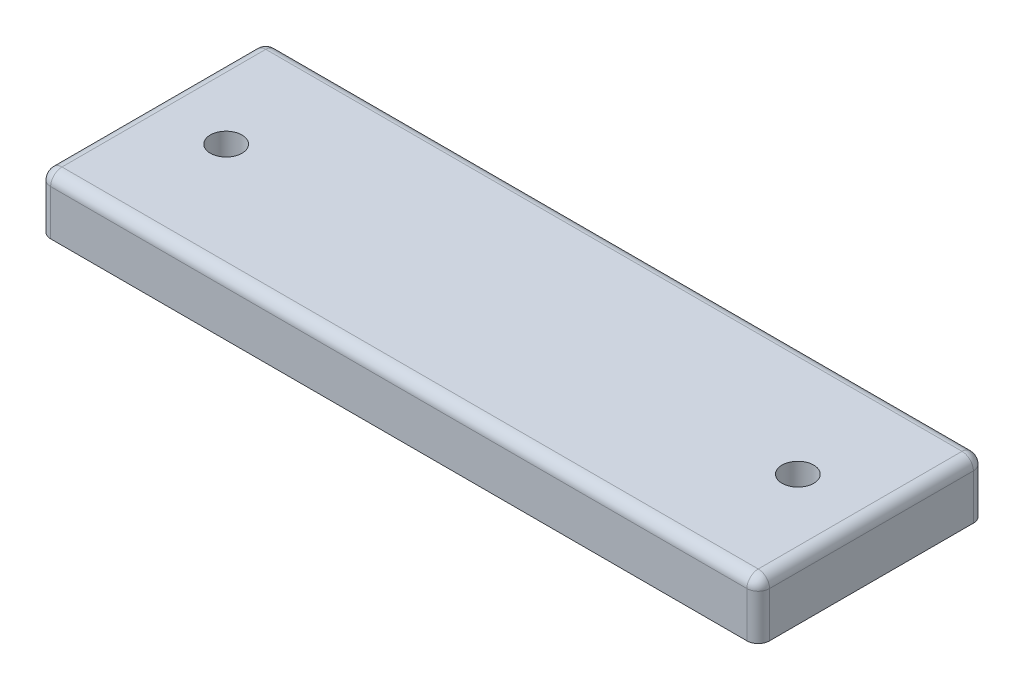
ISO-10303-21;
HEADER;
FILE_DESCRIPTION(('STEP AP214'),'2;1');
FILE_NAME('part.step','',(''),(''),'','','');
FILE_SCHEMA(('AUTOMOTIVE_DESIGN { 1 0 10303 214 1 1 1 1 }'));
ENDSEC;
DATA;
#1=APPLICATION_CONTEXT('core data for automotive mechanical design processes');
#2=APPLICATION_PROTOCOL_DEFINITION('international standard','automotive_design',2000,#1);
#3=PRODUCT_CONTEXT('',#1,'mechanical');
#4=PRODUCT('Part','Part','',(#3));
#5=PRODUCT_RELATED_PRODUCT_CATEGORY('part','',(#4));
#6=PRODUCT_DEFINITION_FORMATION('','',#4);
#7=PRODUCT_DEFINITION_CONTEXT('part definition',#1,'design');
#8=PRODUCT_DEFINITION('design','',#6,#7);
#9=PRODUCT_DEFINITION_SHAPE('','',#8);
#10=(LENGTH_UNIT() NAMED_UNIT(*) SI_UNIT(.MILLI.,.METRE.));
#11=(NAMED_UNIT(*) PLANE_ANGLE_UNIT() SI_UNIT($,.RADIAN.));
#12=(NAMED_UNIT(*) SI_UNIT($,.STERADIAN.) SOLID_ANGLE_UNIT());
#13=UNCERTAINTY_MEASURE_WITH_UNIT(LENGTH_MEASURE(1.E-05),#10,'distance_accuracy_value','');
#14=(GEOMETRIC_REPRESENTATION_CONTEXT(3) GLOBAL_UNCERTAINTY_ASSIGNED_CONTEXT((#13)) GLOBAL_UNIT_ASSIGNED_CONTEXT((#10,
#11,#12)) REPRESENTATION_CONTEXT('',''));
#15=CARTESIAN_POINT('',(0.,0.,0.));
#16=DIRECTION('',(0.,0.,1.));
#17=DIRECTION('',(1.,0.,0.));
#18=AXIS2_PLACEMENT_3D('',#15,#16,#17);
#19=CARTESIAN_POINT('',(0.,5.,0.));
#20=DIRECTION('',(0.,1.,0.));
#21=DIRECTION('',(0.,0.,1.));
#22=AXIS2_PLACEMENT_3D('',#19,#20,#21);
#23=PLANE('',#22);
#24=DIRECTION('',(0.,0.,-1.));
#25=VECTOR('',#24,1.);
#26=CARTESIAN_POINT('',(30.75,5.,-10.));
#27=LINE('',#26,#25);
#28=CARTESIAN_POINT('',(30.75,5.,9.));
#29=VERTEX_POINT('',#28);
#30=CARTESIAN_POINT('',(30.75,5.,-9.));
#31=VERTEX_POINT('',#30);
#32=EDGE_CURVE('E169',#29,#31,#27,.T.);
#33=ORIENTED_EDGE('',*,*,#32,.T.);
#34=DIRECTION('',(-1.,0.,0.));
#35=VECTOR('',#34,1.);
#36=CARTESIAN_POINT('',(-31.75,5.,-9.));
#37=LINE('',#36,#35);
#38=CARTESIAN_POINT('',(-30.75,5.,-9.));
#39=VERTEX_POINT('',#38);
#40=EDGE_CURVE('E171',#31,#39,#37,.T.);
#41=ORIENTED_EDGE('',*,*,#40,.T.);
#42=DIRECTION('',(0.,0.,1.));
#43=VECTOR('',#42,1.);
#44=CARTESIAN_POINT('',(-30.75,5.,10.));
#45=LINE('',#44,#43);
#46=CARTESIAN_POINT('',(-30.75,5.,9.));
#47=VERTEX_POINT('',#46);
#48=EDGE_CURVE('E167',#39,#47,#45,.T.);
#49=ORIENTED_EDGE('',*,*,#48,.T.);
#50=DIRECTION('',(1.,0.,0.));
#51=VECTOR('',#50,1.);
#52=CARTESIAN_POINT('',(31.75,5.,9.));
#53=LINE('',#52,#51);
#54=EDGE_CURVE('E165',#47,#29,#53,.T.);
#55=ORIENTED_EDGE('',*,*,#54,.T.);
#56=EDGE_LOOP('',(#33,#41,#49,#55));
#57=FACE_BOUND('',#56,.T.);
#58=CARTESIAN_POINT('',(-25.25,5.,0.));
#59=DIRECTION('',(0.,1.,0.));
#60=DIRECTION('',(0.,0.,1.));
#61=AXIS2_PLACEMENT_3D('',#58,#59,#60);
#62=CIRCLE('',#61,1.4);
#63=CARTESIAN_POINT('',(-25.25,5.,1.4));
#64=VERTEX_POINT('',#63);
#65=EDGE_CURVE('E141',#64,#64,#62,.T.);
#66=ORIENTED_EDGE('',*,*,#65,.F.);
#67=EDGE_LOOP('',(#66));
#68=FACE_BOUND('',#67,.T.);
#69=CARTESIAN_POINT('',(25.25,5.,0.));
#70=DIRECTION('',(0.,1.,0.));
#71=DIRECTION('',(0.,0.,-1.));
#72=AXIS2_PLACEMENT_3D('',#69,#70,#71);
#73=CIRCLE('',#72,1.4);
#74=CARTESIAN_POINT('',(25.25,5.,-1.4));
#75=VERTEX_POINT('',#74);
#76=EDGE_CURVE('E221',#75,#75,#73,.T.);
#77=ORIENTED_EDGE('',*,*,#76,.F.);
#78=EDGE_LOOP('',(#77));
#79=FACE_BOUND('',#78,.T.);
#80=ADVANCED_FACE('F37',(#57,#68,#79),#23,.T.);
#81=CARTESIAN_POINT('',(0.,0.,0.));
#82=DIRECTION('',(0.,1.,0.));
#83=DIRECTION('',(0.,0.,1.));
#84=AXIS2_PLACEMENT_3D('',#81,#82,#83);
#85=PLANE('',#84);
#86=DIRECTION('',(0.,0.,1.));
#87=VECTOR('',#86,1.);
#88=CARTESIAN_POINT('',(-31.75,0.,-10.));
#89=LINE('',#88,#87);
#90=CARTESIAN_POINT('',(-31.75,0.,-9.));
#91=VERTEX_POINT('',#90);
#92=CARTESIAN_POINT('',(-31.75,0.,9.));
#93=VERTEX_POINT('',#92);
#94=EDGE_CURVE('E129',#91,#93,#89,.T.);
#95=ORIENTED_EDGE('',*,*,#94,.F.);
#96=CARTESIAN_POINT('',(-30.75,0.,-9.));
#97=DIRECTION('',(0.,1.,0.));
#98=DIRECTION('',(0.,0.,1.));
#99=AXIS2_PLACEMENT_3D('',#96,#97,#98);
#100=CIRCLE('',#99,1.);
#101=CARTESIAN_POINT('',(-30.75,0.,-10.));
#102=VERTEX_POINT('',#101);
#103=EDGE_CURVE('E113',#91,#102,#100,.F.);
#104=ORIENTED_EDGE('',*,*,#103,.T.);
#105=DIRECTION('',(-1.,0.,0.));
#106=VECTOR('',#105,1.);
#107=CARTESIAN_POINT('',(-31.75,0.,-10.));
#108=LINE('',#107,#106);
#109=CARTESIAN_POINT('',(30.75,0.,-10.));
#110=VERTEX_POINT('',#109);
#111=EDGE_CURVE('E152',#110,#102,#108,.T.);
#112=ORIENTED_EDGE('',*,*,#111,.F.);
#113=CARTESIAN_POINT('',(30.75,0.,-9.));
#114=DIRECTION('',(0.,1.,0.));
#115=DIRECTION('',(0.,0.,1.));
#116=AXIS2_PLACEMENT_3D('',#113,#114,#115);
#117=CIRCLE('',#116,1.);
#118=CARTESIAN_POINT('',(31.75,0.,-9.));
#119=VERTEX_POINT('',#118);
#120=EDGE_CURVE('E124',#110,#119,#117,.F.);
#121=ORIENTED_EDGE('',*,*,#120,.T.);
#122=DIRECTION('',(0.,0.,-1.));
#123=VECTOR('',#122,1.);
#124=CARTESIAN_POINT('',(31.75,0.,-10.));
#125=LINE('',#124,#123);
#126=CARTESIAN_POINT('',(31.75,0.,9.));
#127=VERTEX_POINT('',#126);
#128=EDGE_CURVE('E143',#127,#119,#125,.T.);
#129=ORIENTED_EDGE('',*,*,#128,.F.);
#130=CARTESIAN_POINT('',(30.75,0.,9.));
#131=DIRECTION('',(0.,1.,0.));
#132=DIRECTION('',(0.,0.,1.));
#133=AXIS2_PLACEMENT_3D('',#130,#131,#132);
#134=CIRCLE('',#133,1.);
#135=CARTESIAN_POINT('',(30.75,0.,10.));
#136=VERTEX_POINT('',#135);
#137=EDGE_CURVE('E158',#127,#136,#134,.F.);
#138=ORIENTED_EDGE('',*,*,#137,.T.);
#139=DIRECTION('',(1.,0.,0.));
#140=VECTOR('',#139,1.);
#141=CARTESIAN_POINT('',(-31.75,0.,10.));
#142=LINE('',#141,#140);
#143=CARTESIAN_POINT('',(-30.75,0.,10.));
#144=VERTEX_POINT('',#143);
#145=EDGE_CURVE('E140',#144,#136,#142,.T.);
#146=ORIENTED_EDGE('',*,*,#145,.F.);
#147=CARTESIAN_POINT('',(-30.75,0.,9.));
#148=DIRECTION('',(0.,1.,0.));
#149=DIRECTION('',(0.,0.,1.));
#150=AXIS2_PLACEMENT_3D('',#147,#148,#149);
#151=CIRCLE('',#150,1.);
#152=EDGE_CURVE('E134',#144,#93,#151,.F.);
#153=ORIENTED_EDGE('',*,*,#152,.T.);
#154=EDGE_LOOP('',(#95,#104,#112,#121,#129,#138,#146,#153));
#155=FACE_BOUND('',#154,.T.);
#156=CARTESIAN_POINT('',(-25.25,0.,0.));
#157=DIRECTION('',(0.,1.,0.));
#158=DIRECTION('',(0.,0.,1.));
#159=AXIS2_PLACEMENT_3D('',#156,#157,#158);
#160=CIRCLE('',#159,1.4);
#161=CARTESIAN_POINT('',(-25.25,0.,1.4));
#162=VERTEX_POINT('',#161);
#163=EDGE_CURVE('E146',#162,#162,#160,.T.);
#164=ORIENTED_EDGE('',*,*,#163,.T.);
#165=EDGE_LOOP('',(#164));
#166=FACE_BOUND('',#165,.T.);
#167=CARTESIAN_POINT('',(25.25,0.,0.));
#168=DIRECTION('',(0.,1.,0.));
#169=DIRECTION('',(0.,0.,-1.));
#170=AXIS2_PLACEMENT_3D('',#167,#168,#169);
#171=CIRCLE('',#170,1.4);
#172=CARTESIAN_POINT('',(25.25,0.,-1.4));
#173=VERTEX_POINT('',#172);
#174=EDGE_CURVE('E217',#173,#173,#171,.T.);
#175=ORIENTED_EDGE('',*,*,#174,.T.);
#176=EDGE_LOOP('',(#175));
#177=FACE_BOUND('',#176,.T.);
#178=ADVANCED_FACE('F136',(#155,#166,#177),#85,.F.);
#179=CARTESIAN_POINT('',(-31.75,5.,-10.));
#180=DIRECTION('',(1.,0.,0.));
#181=DIRECTION('',(0.,0.,-1.));
#182=AXIS2_PLACEMENT_3D('',#179,#180,#181);
#183=PLANE('',#182);
#184=DIRECTION('',(0.,0.,1.));
#185=VECTOR('',#184,1.);
#186=CARTESIAN_POINT('',(-31.75,4.,-10.));
#187=LINE('',#186,#185);
#188=CARTESIAN_POINT('',(-31.75,4.,9.));
#189=VERTEX_POINT('',#188);
#190=CARTESIAN_POINT('',(-31.75,4.,-9.));
#191=VERTEX_POINT('',#190);
#192=EDGE_CURVE('E132',#189,#191,#187,.F.);
#193=ORIENTED_EDGE('',*,*,#192,.T.);
#194=DIRECTION('',(0.,-1.,0.));
#195=VECTOR('',#194,1.);
#196=CARTESIAN_POINT('',(-31.75,5.,-9.));
#197=LINE('',#196,#195);
#198=EDGE_CURVE('E117',#191,#91,#197,.T.);
#199=ORIENTED_EDGE('',*,*,#198,.T.);
#200=ORIENTED_EDGE('',*,*,#94,.T.);
#201=DIRECTION('',(0.,-1.,0.));
#202=VECTOR('',#201,1.);
#203=CARTESIAN_POINT('',(-31.75,5.,9.));
#204=LINE('',#203,#202);
#205=EDGE_CURVE('E154',#93,#189,#204,.F.);
#206=ORIENTED_EDGE('',*,*,#205,.T.);
#207=EDGE_LOOP('',(#193,#199,#200,#206));
#208=FACE_BOUND('',#207,.T.);
#209=ADVANCED_FACE('F128',(#208),#183,.F.);
#210=CARTESIAN_POINT('',(-31.75,5.,10.));
#211=DIRECTION('',(0.,0.,-1.));
#212=DIRECTION('',(-1.,0.,0.));
#213=AXIS2_PLACEMENT_3D('',#210,#211,#212);
#214=PLANE('',#213);
#215=ORIENTED_EDGE('',*,*,#145,.T.);
#216=DIRECTION('',(0.,-1.,0.));
#217=VECTOR('',#216,1.);
#218=CARTESIAN_POINT('',(30.75,5.,10.));
#219=LINE('',#218,#217);
#220=CARTESIAN_POINT('',(30.75,4.,10.));
#221=VERTEX_POINT('',#220);
#222=EDGE_CURVE('E11',#136,#221,#219,.F.);
#223=ORIENTED_EDGE('',*,*,#222,.T.);
#224=DIRECTION('',(1.,0.,0.));
#225=VECTOR('',#224,1.);
#226=CARTESIAN_POINT('',(-31.75,4.,10.));
#227=LINE('',#226,#225);
#228=CARTESIAN_POINT('',(-30.75,4.,10.));
#229=VERTEX_POINT('',#228);
#230=EDGE_CURVE('E46',#221,#229,#227,.F.);
#231=ORIENTED_EDGE('',*,*,#230,.T.);
#232=DIRECTION('',(0.,-1.,0.));
#233=VECTOR('',#232,1.);
#234=CARTESIAN_POINT('',(-30.75,5.,10.));
#235=LINE('',#234,#233);
#236=EDGE_CURVE('E180',#229,#144,#235,.T.);
#237=ORIENTED_EDGE('',*,*,#236,.T.);
#238=EDGE_LOOP('',(#215,#223,#231,#237));
#239=FACE_BOUND('',#238,.T.);
#240=ADVANCED_FACE('F257',(#239),#214,.F.);
#241=CARTESIAN_POINT('',(31.75,5.,-10.));
#242=DIRECTION('',(-1.,0.,0.));
#243=DIRECTION('',(0.,0.,1.));
#244=AXIS2_PLACEMENT_3D('',#241,#242,#243);
#245=PLANE('',#244);
#246=ORIENTED_EDGE('',*,*,#128,.T.);
#247=DIRECTION('',(0.,-1.,0.));
#248=VECTOR('',#247,1.);
#249=CARTESIAN_POINT('',(31.75,5.,-9.));
#250=LINE('',#249,#248);
#251=CARTESIAN_POINT('',(31.75,4.,-9.));
#252=VERTEX_POINT('',#251);
#253=EDGE_CURVE('E178',#119,#252,#250,.F.);
#254=ORIENTED_EDGE('',*,*,#253,.T.);
#255=DIRECTION('',(0.,0.,-1.));
#256=VECTOR('',#255,1.);
#257=CARTESIAN_POINT('',(31.75,4.,10.));
#258=LINE('',#257,#256);
#259=CARTESIAN_POINT('',(31.75,4.,9.));
#260=VERTEX_POINT('',#259);
#261=EDGE_CURVE('E174',#252,#260,#258,.F.);
#262=ORIENTED_EDGE('',*,*,#261,.T.);
#263=DIRECTION('',(0.,-1.,0.));
#264=VECTOR('',#263,1.);
#265=CARTESIAN_POINT('',(31.75,5.,9.));
#266=LINE('',#265,#264);
#267=EDGE_CURVE('E176',#260,#127,#266,.T.);
#268=ORIENTED_EDGE('',*,*,#267,.T.);
#269=EDGE_LOOP('',(#246,#254,#262,#268));
#270=FACE_BOUND('',#269,.T.);
#271=ADVANCED_FACE('F243',(#270),#245,.F.);
#272=CARTESIAN_POINT('',(-31.75,5.,-10.));
#273=DIRECTION('',(0.,0.,1.));
#274=DIRECTION('',(1.,0.,0.));
#275=AXIS2_PLACEMENT_3D('',#272,#273,#274);
#276=PLANE('',#275);
#277=ORIENTED_EDGE('',*,*,#111,.T.);
#278=DIRECTION('',(0.,-1.,0.));
#279=VECTOR('',#278,1.);
#280=CARTESIAN_POINT('',(-30.75,5.,-10.));
#281=LINE('',#280,#279);
#282=CARTESIAN_POINT('',(-30.75,4.,-10.));
#283=VERTEX_POINT('',#282);
#284=EDGE_CURVE('E118',#102,#283,#281,.F.);
#285=ORIENTED_EDGE('',*,*,#284,.T.);
#286=DIRECTION('',(-1.,0.,0.));
#287=VECTOR('',#286,1.);
#288=CARTESIAN_POINT('',(31.75,4.,-10.));
#289=LINE('',#288,#287);
#290=CARTESIAN_POINT('',(30.75,4.,-10.));
#291=VERTEX_POINT('',#290);
#292=EDGE_CURVE('E162',#283,#291,#289,.F.);
#293=ORIENTED_EDGE('',*,*,#292,.T.);
#294=DIRECTION('',(0.,-1.,0.));
#295=VECTOR('',#294,1.);
#296=CARTESIAN_POINT('',(30.75,5.,-10.));
#297=LINE('',#296,#295);
#298=EDGE_CURVE('E123',#291,#110,#297,.T.);
#299=ORIENTED_EDGE('',*,*,#298,.T.);
#300=EDGE_LOOP('',(#277,#285,#293,#299));
#301=FACE_BOUND('',#300,.T.);
#302=ADVANCED_FACE('F235',(#301),#276,.F.);
#303=CARTESIAN_POINT('',(-25.25,5.,0.));
#304=DIRECTION('',(0.,-1.,0.));
#305=DIRECTION('',(0.,0.,-1.));
#306=AXIS2_PLACEMENT_3D('',#303,#304,#305);
#307=CYLINDRICAL_SURFACE('',#306,1.4);
#308=ORIENTED_EDGE('',*,*,#65,.T.);
#309=EDGE_LOOP('',(#308));
#310=FACE_BOUND('',#309,.T.);
#311=ORIENTED_EDGE('',*,*,#163,.F.);
#312=EDGE_LOOP('',(#311));
#313=FACE_BOUND('',#312,.T.);
#314=ADVANCED_FACE('F232',(#310,#313),#307,.F.);
#315=CARTESIAN_POINT('',(25.25,5.,0.));
#316=DIRECTION('',(0.,-1.,0.));
#317=DIRECTION('',(0.,0.,-1.));
#318=AXIS2_PLACEMENT_3D('',#315,#316,#317);
#319=CYLINDRICAL_SURFACE('',#318,1.4);
#320=ORIENTED_EDGE('',*,*,#76,.T.);
#321=EDGE_LOOP('',(#320));
#322=FACE_BOUND('',#321,.T.);
#323=ORIENTED_EDGE('',*,*,#174,.F.);
#324=EDGE_LOOP('',(#323));
#325=FACE_BOUND('',#324,.T.);
#326=ADVANCED_FACE('F234',(#322,#325),#319,.F.);
#327=CARTESIAN_POINT('',(30.75,5.,9.));
#328=DIRECTION('',(0.,-1.,0.));
#329=DIRECTION('',(0.,0.,-1.));
#330=AXIS2_PLACEMENT_3D('',#327,#328,#329);
#331=CYLINDRICAL_SURFACE('',#330,1.);
#332=CARTESIAN_POINT('',(30.75,4.,9.));
#333=DIRECTION('',(0.,1.,0.));
#334=DIRECTION('',(0.,0.,1.));
#335=AXIS2_PLACEMENT_3D('',#332,#333,#334);
#336=CIRCLE('',#335,1.);
#337=EDGE_CURVE('E41',#221,#260,#336,.T.);
#338=ORIENTED_EDGE('',*,*,#337,.F.);
#339=ORIENTED_EDGE('',*,*,#222,.F.);
#340=ORIENTED_EDGE('',*,*,#137,.F.);
#341=ORIENTED_EDGE('',*,*,#267,.F.);
#342=EDGE_LOOP('',(#338,#339,#340,#341));
#343=FACE_BOUND('',#342,.T.);
#344=ADVANCED_FACE('F39',(#343),#331,.T.);
#345=CARTESIAN_POINT('',(30.75,4.,9.));
#346=DIRECTION('',(1.,0.,0.));
#347=DIRECTION('',(0.,0.,-1.));
#348=AXIS2_PLACEMENT_3D('',#345,#346,#347);
#349=SPHERICAL_SURFACE('',#348,1.);
#350=CARTESIAN_POINT('',(30.75,4.,9.));
#351=DIRECTION('',(1.,0.,0.));
#352=DIRECTION('',(0.,0.,-1.));
#353=AXIS2_PLACEMENT_3D('',#350,#351,#352);
#354=CIRCLE('',#353,1.);
#355=EDGE_CURVE('E208',#221,#29,#354,.F.);
#356=ORIENTED_EDGE('',*,*,#355,.F.);
#357=ORIENTED_EDGE('',*,*,#337,.T.);
#358=CARTESIAN_POINT('',(30.75,4.,9.));
#359=DIRECTION('',(0.,0.,1.));
#360=DIRECTION('',(0.,-1.,0.));
#361=AXIS2_PLACEMENT_3D('',#358,#359,#360);
#362=CIRCLE('',#361,1.);
#363=EDGE_CURVE('E210',#29,#260,#362,.F.);
#364=ORIENTED_EDGE('',*,*,#363,.F.);
#365=EDGE_LOOP('',(#356,#357,#364));
#366=FACE_BOUND('',#365,.T.);
#367=ADVANCED_FACE('F298',(#366),#349,.T.);
#368=CARTESIAN_POINT('',(30.75,5.,-9.));
#369=DIRECTION('',(0.,-1.,0.));
#370=DIRECTION('',(0.,0.,-1.));
#371=AXIS2_PLACEMENT_3D('',#368,#369,#370);
#372=CYLINDRICAL_SURFACE('',#371,1.);
#373=ORIENTED_EDGE('',*,*,#120,.F.);
#374=ORIENTED_EDGE('',*,*,#298,.F.);
#375=CARTESIAN_POINT('',(30.75,4.,-9.));
#376=DIRECTION('',(0.,1.,0.));
#377=DIRECTION('',(0.,0.,1.));
#378=AXIS2_PLACEMENT_3D('',#375,#376,#377);
#379=CIRCLE('',#378,1.);
#380=EDGE_CURVE('E205',#252,#291,#379,.T.);
#381=ORIENTED_EDGE('',*,*,#380,.F.);
#382=ORIENTED_EDGE('',*,*,#253,.F.);
#383=EDGE_LOOP('',(#373,#374,#381,#382));
#384=FACE_BOUND('',#383,.T.);
#385=ADVANCED_FACE('F296',(#384),#372,.T.);
#386=CARTESIAN_POINT('',(30.75,4.,0.));
#387=DIRECTION('',(0.,0.,1.));
#388=DIRECTION('',(1.,0.,0.));
#389=AXIS2_PLACEMENT_3D('',#386,#387,#388);
#390=CYLINDRICAL_SURFACE('',#389,1.);
#391=ORIENTED_EDGE('',*,*,#363,.T.);
#392=ORIENTED_EDGE('',*,*,#261,.F.);
#393=CARTESIAN_POINT('',(30.75,4.,-9.));
#394=DIRECTION('',(0.,0.,-1.));
#395=DIRECTION('',(-1.,0.,0.));
#396=AXIS2_PLACEMENT_3D('',#393,#394,#395);
#397=CIRCLE('',#396,1.);
#398=EDGE_CURVE('E202',#31,#252,#397,.T.);
#399=ORIENTED_EDGE('',*,*,#398,.F.);
#400=ORIENTED_EDGE('',*,*,#32,.F.);
#401=EDGE_LOOP('',(#391,#392,#399,#400));
#402=FACE_BOUND('',#401,.T.);
#403=ADVANCED_FACE('F292',(#402),#390,.T.);
#404=CARTESIAN_POINT('',(0.,4.,9.));
#405=DIRECTION('',(-1.,0.,0.));
#406=DIRECTION('',(0.,0.,1.));
#407=AXIS2_PLACEMENT_3D('',#404,#405,#406);
#408=CYLINDRICAL_SURFACE('',#407,1.);
#409=ORIENTED_EDGE('',*,*,#355,.T.);
#410=ORIENTED_EDGE('',*,*,#54,.F.);
#411=CARTESIAN_POINT('',(-30.75,4.,9.));
#412=DIRECTION('',(-1.,0.,0.));
#413=DIRECTION('',(0.,0.,1.));
#414=AXIS2_PLACEMENT_3D('',#411,#412,#413);
#415=CIRCLE('',#414,1.);
#416=EDGE_CURVE('E199',#229,#47,#415,.T.);
#417=ORIENTED_EDGE('',*,*,#416,.F.);
#418=ORIENTED_EDGE('',*,*,#230,.F.);
#419=EDGE_LOOP('',(#409,#410,#417,#418));
#420=FACE_BOUND('',#419,.T.);
#421=ADVANCED_FACE('F288',(#420),#408,.T.);
#422=CARTESIAN_POINT('',(-30.75,5.,9.));
#423=DIRECTION('',(0.,-1.,0.));
#424=DIRECTION('',(0.,0.,-1.));
#425=AXIS2_PLACEMENT_3D('',#422,#423,#424);
#426=CYLINDRICAL_SURFACE('',#425,1.);
#427=ORIENTED_EDGE('',*,*,#152,.F.);
#428=ORIENTED_EDGE('',*,*,#236,.F.);
#429=CARTESIAN_POINT('',(-30.75,4.,9.));
#430=DIRECTION('',(0.,1.,0.));
#431=DIRECTION('',(0.,0.,1.));
#432=AXIS2_PLACEMENT_3D('',#429,#430,#431);
#433=CIRCLE('',#432,1.);
#434=EDGE_CURVE('E196',#189,#229,#433,.T.);
#435=ORIENTED_EDGE('',*,*,#434,.F.);
#436=ORIENTED_EDGE('',*,*,#205,.F.);
#437=EDGE_LOOP('',(#427,#428,#435,#436));
#438=FACE_BOUND('',#437,.T.);
#439=ADVANCED_FACE('F284',(#438),#426,.T.);
#440=CARTESIAN_POINT('',(30.75,4.,-9.));
#441=DIRECTION('',(1.,0.,0.));
#442=DIRECTION('',(0.,0.,-1.));
#443=AXIS2_PLACEMENT_3D('',#440,#441,#442);
#444=SPHERICAL_SURFACE('',#443,1.);
#445=ORIENTED_EDGE('',*,*,#398,.T.);
#446=ORIENTED_EDGE('',*,*,#380,.T.);
#447=CARTESIAN_POINT('',(30.75,4.,-9.));
#448=DIRECTION('',(1.,0.,0.));
#449=DIRECTION('',(0.,0.,-1.));
#450=AXIS2_PLACEMENT_3D('',#447,#448,#449);
#451=CIRCLE('',#450,1.);
#452=EDGE_CURVE('E193',#31,#291,#451,.F.);
#453=ORIENTED_EDGE('',*,*,#452,.F.);
#454=EDGE_LOOP('',(#445,#446,#453));
#455=FACE_BOUND('',#454,.T.);
#456=ADVANCED_FACE('F280',(#455),#444,.T.);
#457=CARTESIAN_POINT('',(-30.75,4.,9.));
#458=DIRECTION('',(0.,0.,1.));
#459=DIRECTION('',(1.,0.,0.));
#460=AXIS2_PLACEMENT_3D('',#457,#458,#459);
#461=SPHERICAL_SURFACE('',#460,1.);
#462=ORIENTED_EDGE('',*,*,#434,.T.);
#463=ORIENTED_EDGE('',*,*,#416,.T.);
#464=CARTESIAN_POINT('',(-30.75,4.,9.));
#465=DIRECTION('',(0.,0.,1.));
#466=DIRECTION('',(1.,0.,0.));
#467=AXIS2_PLACEMENT_3D('',#464,#465,#466);
#468=CIRCLE('',#467,1.);
#469=EDGE_CURVE('E190',#189,#47,#468,.F.);
#470=ORIENTED_EDGE('',*,*,#469,.F.);
#471=EDGE_LOOP('',(#462,#463,#470));
#472=FACE_BOUND('',#471,.T.);
#473=ADVANCED_FACE('F276',(#472),#461,.T.);
#474=CARTESIAN_POINT('',(0.,4.,-9.));
#475=DIRECTION('',(1.,0.,0.));
#476=DIRECTION('',(0.,0.,-1.));
#477=AXIS2_PLACEMENT_3D('',#474,#475,#476);
#478=CYLINDRICAL_SURFACE('',#477,1.);
#479=ORIENTED_EDGE('',*,*,#452,.T.);
#480=ORIENTED_EDGE('',*,*,#292,.F.);
#481=CARTESIAN_POINT('',(-30.75,4.,-9.));
#482=DIRECTION('',(-1.,0.,0.));
#483=DIRECTION('',(0.,0.,1.));
#484=AXIS2_PLACEMENT_3D('',#481,#482,#483);
#485=CIRCLE('',#484,1.);
#486=EDGE_CURVE('E187',#39,#283,#485,.T.);
#487=ORIENTED_EDGE('',*,*,#486,.F.);
#488=ORIENTED_EDGE('',*,*,#40,.F.);
#489=EDGE_LOOP('',(#479,#480,#487,#488));
#490=FACE_BOUND('',#489,.T.);
#491=ADVANCED_FACE('F272',(#490),#478,.T.);
#492=CARTESIAN_POINT('',(-30.75,4.,0.));
#493=DIRECTION('',(0.,0.,-1.));
#494=DIRECTION('',(-1.,0.,0.));
#495=AXIS2_PLACEMENT_3D('',#492,#493,#494);
#496=CYLINDRICAL_SURFACE('',#495,1.);
#497=ORIENTED_EDGE('',*,*,#469,.T.);
#498=ORIENTED_EDGE('',*,*,#48,.F.);
#499=CARTESIAN_POINT('',(-30.75,4.,-9.));
#500=DIRECTION('',(0.,0.,-1.));
#501=DIRECTION('',(-1.,0.,0.));
#502=AXIS2_PLACEMENT_3D('',#499,#500,#501);
#503=CIRCLE('',#502,1.);
#504=EDGE_CURVE('E185',#191,#39,#503,.T.);
#505=ORIENTED_EDGE('',*,*,#504,.F.);
#506=ORIENTED_EDGE('',*,*,#192,.F.);
#507=EDGE_LOOP('',(#497,#498,#505,#506));
#508=FACE_BOUND('',#507,.T.);
#509=ADVANCED_FACE('F268',(#508),#496,.T.);
#510=CARTESIAN_POINT('',(-30.75,4.,-9.));
#511=DIRECTION('',(0.,1.,0.));
#512=DIRECTION('',(0.,0.,1.));
#513=AXIS2_PLACEMENT_3D('',#510,#511,#512);
#514=SPHERICAL_SURFACE('',#513,1.);
#515=ORIENTED_EDGE('',*,*,#504,.T.);
#516=ORIENTED_EDGE('',*,*,#486,.T.);
#517=CARTESIAN_POINT('',(-30.75,4.,-9.));
#518=DIRECTION('',(0.,1.,0.));
#519=DIRECTION('',(0.,0.,1.));
#520=AXIS2_PLACEMENT_3D('',#517,#518,#519);
#521=CIRCLE('',#520,1.);
#522=EDGE_CURVE('E183',#191,#283,#521,.F.);
#523=ORIENTED_EDGE('',*,*,#522,.F.);
#524=EDGE_LOOP('',(#515,#516,#523));
#525=FACE_BOUND('',#524,.T.);
#526=ADVANCED_FACE('F265',(#525),#514,.T.);
#527=CARTESIAN_POINT('',(-30.75,5.,-9.));
#528=DIRECTION('',(0.,-1.,0.));
#529=DIRECTION('',(0.,0.,-1.));
#530=AXIS2_PLACEMENT_3D('',#527,#528,#529);
#531=CYLINDRICAL_SURFACE('',#530,1.);
#532=ORIENTED_EDGE('',*,*,#522,.T.);
#533=ORIENTED_EDGE('',*,*,#284,.F.);
#534=ORIENTED_EDGE('',*,*,#103,.F.);
#535=ORIENTED_EDGE('',*,*,#198,.F.);
#536=EDGE_LOOP('',(#532,#533,#534,#535));
#537=FACE_BOUND('',#536,.T.);
#538=ADVANCED_FACE('F116',(#537),#531,.T.);
#539=CLOSED_SHELL('',(#80,#178,#209,#240,#271,#302,#314,#326,#344,#367,#385,#403,#421,#439,#456,
#473,#491,#509,#526,#538));
#540=MANIFOLD_SOLID_BREP('B2',#539);
#541=ADVANCED_BREP_SHAPE_REPRESENTATION('',(#18,#540),#14);
#542=SHAPE_DEFINITION_REPRESENTATION(#9,#541);
ENDSEC;
END-ISO-10303-21;
